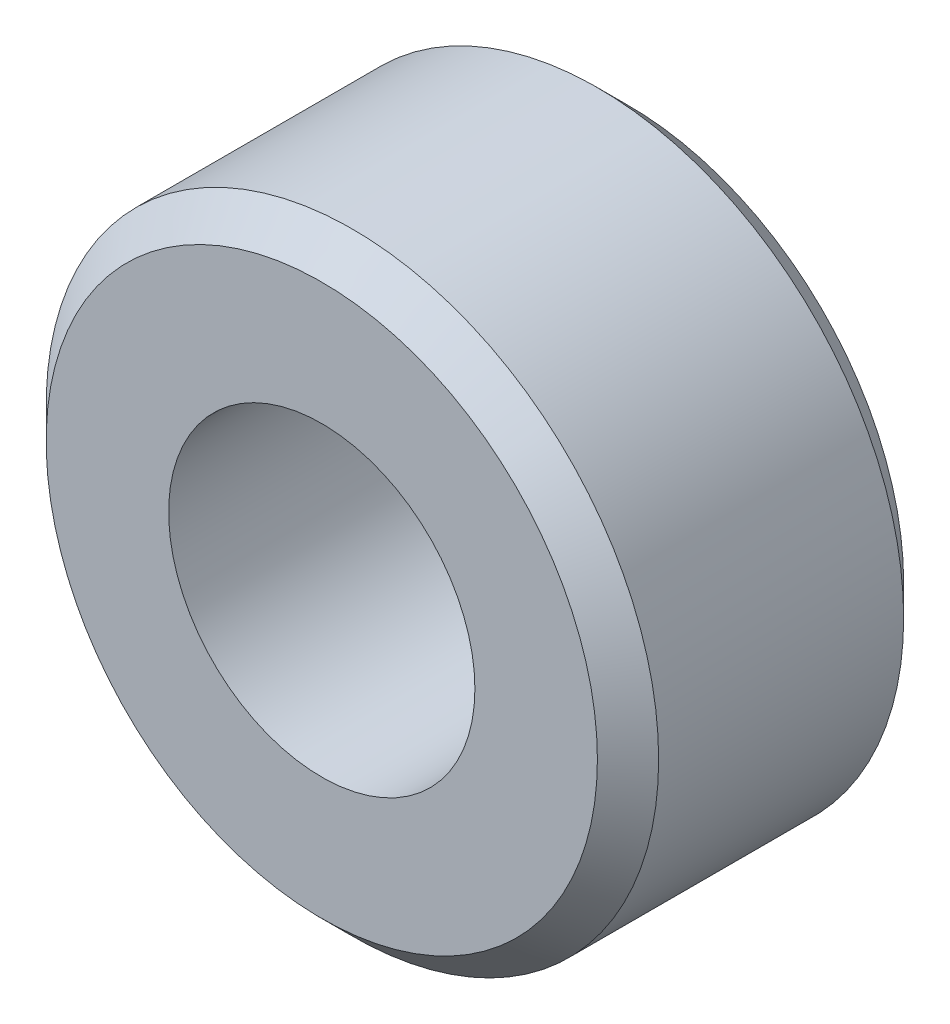
ISO-10303-21;
HEADER;
FILE_DESCRIPTION(('STEP AP214'),'2;1');
FILE_NAME('part.step','',(''),(''),'','','');
FILE_SCHEMA(('AUTOMOTIVE_DESIGN { 1 0 10303 214 1 1 1 1 }'));
ENDSEC;
DATA;
#1=APPLICATION_CONTEXT('core data for automotive mechanical design processes');
#2=APPLICATION_PROTOCOL_DEFINITION('international standard','automotive_design',2000,#1);
#3=PRODUCT_CONTEXT('',#1,'mechanical');
#4=PRODUCT('Part','Part','',(#3));
#5=PRODUCT_RELATED_PRODUCT_CATEGORY('part','',(#4));
#6=PRODUCT_DEFINITION_FORMATION('','',#4);
#7=PRODUCT_DEFINITION_CONTEXT('part definition',#1,'design');
#8=PRODUCT_DEFINITION('design','',#6,#7);
#9=PRODUCT_DEFINITION_SHAPE('','',#8);
#10=(LENGTH_UNIT() NAMED_UNIT(*) SI_UNIT(.MILLI.,.METRE.));
#11=(NAMED_UNIT(*) PLANE_ANGLE_UNIT() SI_UNIT($,.RADIAN.));
#12=(NAMED_UNIT(*) SI_UNIT($,.STERADIAN.) SOLID_ANGLE_UNIT());
#13=UNCERTAINTY_MEASURE_WITH_UNIT(LENGTH_MEASURE(1.E-05),#10,'distance_accuracy_value','');
#14=(GEOMETRIC_REPRESENTATION_CONTEXT(3) GLOBAL_UNCERTAINTY_ASSIGNED_CONTEXT((#13)) GLOBAL_UNIT_ASSIGNED_CONTEXT((#10,
#11,#12)) REPRESENTATION_CONTEXT('',''));
#15=CARTESIAN_POINT('',(0.,0.,0.));
#16=DIRECTION('',(0.,0.,1.));
#17=DIRECTION('',(1.,0.,0.));
#18=AXIS2_PLACEMENT_3D('',#15,#16,#17);
#19=CARTESIAN_POINT('',(0.,0.,10.));
#20=DIRECTION('',(0.,0.,1.));
#21=DIRECTION('',(1.,0.,0.));
#22=AXIS2_PLACEMENT_3D('',#19,#20,#21);
#23=PLANE('',#22);
#24=CARTESIAN_POINT('',(0.,0.,10.));
#25=DIRECTION('',(0.,0.,1.));
#26=DIRECTION('',(1.,0.,0.));
#27=AXIS2_PLACEMENT_3D('',#24,#25,#26);
#28=CIRCLE('',#27,8.99999999999999);
#29=CARTESIAN_POINT('',(8.99999999999999,0.,10.));
#30=VERTEX_POINT('',#29);
#31=EDGE_CURVE('E10',#30,#30,#28,.T.);
#32=ORIENTED_EDGE('',*,*,#31,.T.);
#33=EDGE_LOOP('',(#32));
#34=FACE_BOUND('',#33,.T.);
#35=CARTESIAN_POINT('',(0.,0.,10.));
#36=DIRECTION('',(0.,0.,1.));
#37=DIRECTION('',(1.,0.,0.));
#38=AXIS2_PLACEMENT_3D('',#35,#36,#37);
#39=CIRCLE('',#38,5.);
#40=CARTESIAN_POINT('',(5.,0.,10.));
#41=VERTEX_POINT('',#40);
#42=EDGE_CURVE('E70',#41,#41,#39,.T.);
#43=ORIENTED_EDGE('',*,*,#42,.F.);
#44=EDGE_LOOP('',(#43));
#45=FACE_BOUND('',#44,.T.);
#46=ADVANCED_FACE('F45',(#34,#45),#23,.T.);
#47=CARTESIAN_POINT('',(0.,0.,0.));
#48=DIRECTION('',(0.,0.,1.));
#49=DIRECTION('',(1.,0.,0.));
#50=AXIS2_PLACEMENT_3D('',#47,#48,#49);
#51=PLANE('',#50);
#52=CARTESIAN_POINT('',(0.,0.,0.));
#53=DIRECTION('',(0.,0.,1.));
#54=DIRECTION('',(1.,0.,0.));
#55=AXIS2_PLACEMENT_3D('',#52,#53,#54);
#56=CIRCLE('',#55,8.99999999999999);
#57=CARTESIAN_POINT('',(8.99999999999999,0.,0.));
#58=VERTEX_POINT('',#57);
#59=EDGE_CURVE('E54',#58,#58,#56,.F.);
#60=ORIENTED_EDGE('',*,*,#59,.T.);
#61=EDGE_LOOP('',(#60));
#62=FACE_BOUND('',#61,.T.);
#63=CARTESIAN_POINT('',(0.,0.,0.));
#64=DIRECTION('',(0.,0.,1.));
#65=DIRECTION('',(1.,0.,0.));
#66=AXIS2_PLACEMENT_3D('',#63,#64,#65);
#67=CIRCLE('',#66,5.);
#68=CARTESIAN_POINT('',(5.,0.,0.));
#69=VERTEX_POINT('',#68);
#70=EDGE_CURVE('E71',#69,#69,#67,.T.);
#71=ORIENTED_EDGE('',*,*,#70,.T.);
#72=EDGE_LOOP('',(#71));
#73=FACE_BOUND('',#72,.T.);
#74=ADVANCED_FACE('F83',(#62,#73),#51,.F.);
#75=CARTESIAN_POINT('',(0.,0.,10.));
#76=DIRECTION('',(0.,0.,-1.));
#77=DIRECTION('',(-1.,0.,0.));
#78=AXIS2_PLACEMENT_3D('',#75,#76,#77);
#79=CYLINDRICAL_SURFACE('',#78,10.);
#80=CARTESIAN_POINT('',(0.,0.,1.));
#81=DIRECTION('',(0.,0.,1.));
#82=DIRECTION('',(1.,0.,0.));
#83=AXIS2_PLACEMENT_3D('',#80,#81,#82);
#84=CIRCLE('',#83,10.);
#85=CARTESIAN_POINT('',(10.,0.,1.));
#86=VERTEX_POINT('',#85);
#87=EDGE_CURVE('E59',#86,#86,#84,.T.);
#88=ORIENTED_EDGE('',*,*,#87,.T.);
#89=EDGE_LOOP('',(#88));
#90=FACE_BOUND('',#89,.T.);
#91=CARTESIAN_POINT('',(0.,0.,8.99999999999999));
#92=DIRECTION('',(0.,0.,1.));
#93=DIRECTION('',(1.,0.,0.));
#94=AXIS2_PLACEMENT_3D('',#91,#92,#93);
#95=CIRCLE('',#94,10.);
#96=CARTESIAN_POINT('',(10.,0.,8.99999999999999));
#97=VERTEX_POINT('',#96);
#98=EDGE_CURVE('E64',#97,#97,#95,.F.);
#99=ORIENTED_EDGE('',*,*,#98,.T.);
#100=EDGE_LOOP('',(#99));
#101=FACE_BOUND('',#100,.T.);
#102=ADVANCED_FACE('F89',(#90,#101),#79,.T.);
#103=CARTESIAN_POINT('',(0.,0.,10.));
#104=DIRECTION('',(0.,0.,-1.));
#105=DIRECTION('',(-1.,0.,0.));
#106=AXIS2_PLACEMENT_3D('',#103,#104,#105);
#107=CYLINDRICAL_SURFACE('',#106,5.);
#108=ORIENTED_EDGE('',*,*,#42,.T.);
#109=EDGE_LOOP('',(#108));
#110=FACE_BOUND('',#109,.T.);
#111=ORIENTED_EDGE('',*,*,#70,.F.);
#112=EDGE_LOOP('',(#111));
#113=FACE_BOUND('',#112,.T.);
#114=ADVANCED_FACE('F79',(#110,#113),#107,.F.);
#115=CARTESIAN_POINT('',(0.,0.,1.));
#116=DIRECTION('',(0.,0.,1.));
#117=DIRECTION('',(1.,0.,0.));
#118=AXIS2_PLACEMENT_3D('',#115,#116,#117);
#119=CONICAL_SURFACE('',#118,10.,0.78539816339745);
#120=ORIENTED_EDGE('',*,*,#59,.F.);
#121=EDGE_LOOP('',(#120));
#122=FACE_BOUND('',#121,.T.);
#123=ORIENTED_EDGE('',*,*,#87,.F.);
#124=EDGE_LOOP('',(#123));
#125=FACE_BOUND('',#124,.T.);
#126=ADVANCED_FACE('F96',(#122,#125),#119,.T.);
#127=CARTESIAN_POINT('',(0.,0.,10.));
#128=DIRECTION('',(0.,0.,-1.));
#129=DIRECTION('',(-1.,0.,0.));
#130=AXIS2_PLACEMENT_3D('',#127,#128,#129);
#131=CONICAL_SURFACE('',#130,8.99999999999999,0.785398163397447);
#132=ORIENTED_EDGE('',*,*,#98,.F.);
#133=EDGE_LOOP('',(#132));
#134=FACE_BOUND('',#133,.T.);
#135=ORIENTED_EDGE('',*,*,#31,.F.);
#136=EDGE_LOOP('',(#135));
#137=FACE_BOUND('',#136,.T.);
#138=ADVANCED_FACE('F48',(#134,#137),#131,.T.);
#139=CLOSED_SHELL('',(#46,#74,#102,#114,#126,#138));
#140=MANIFOLD_SOLID_BREP('B2',#139);
#141=ADVANCED_BREP_SHAPE_REPRESENTATION('',(#18,#140),#14);
#142=SHAPE_DEFINITION_REPRESENTATION(#9,#141);
ENDSEC;
END-ISO-10303-21;
